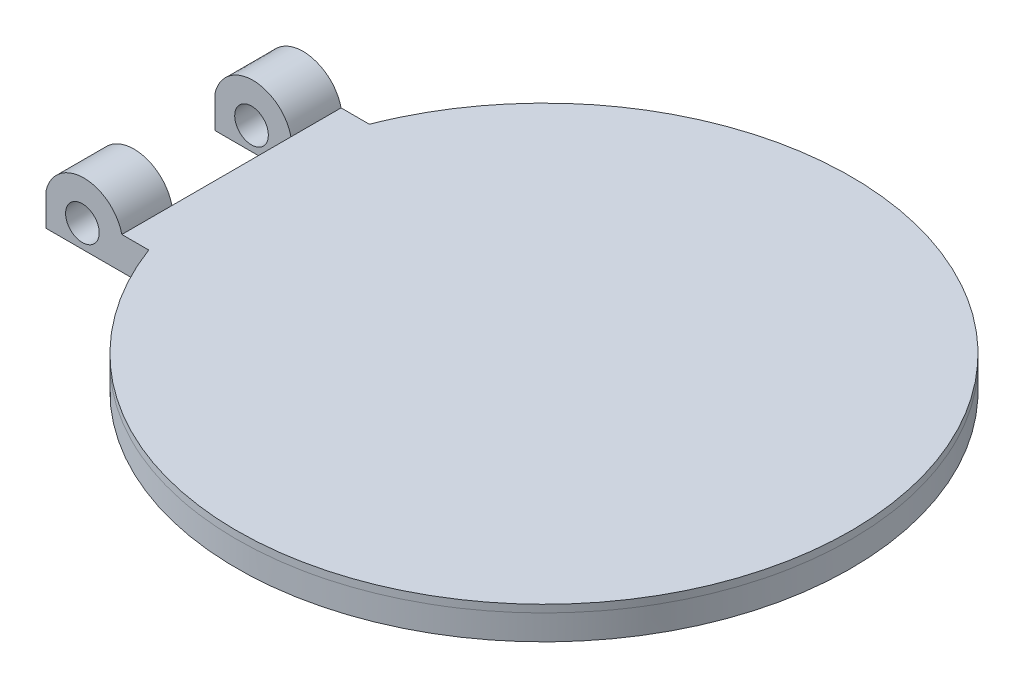
ISO-10303-21;
HEADER;
FILE_DESCRIPTION(('STEP AP214'),'2;1');
FILE_NAME('part.step','',(''),(''),'','','');
FILE_SCHEMA(('AUTOMOTIVE_DESIGN { 1 0 10303 214 1 1 1 1 }'));
ENDSEC;
DATA;
#1=APPLICATION_CONTEXT('core data for automotive mechanical design processes');
#2=APPLICATION_PROTOCOL_DEFINITION('international standard','automotive_design',2000,#1);
#3=PRODUCT_CONTEXT('',#1,'mechanical');
#4=PRODUCT('Part','Part','',(#3));
#5=PRODUCT_RELATED_PRODUCT_CATEGORY('part','',(#4));
#6=PRODUCT_DEFINITION_FORMATION('','',#4);
#7=PRODUCT_DEFINITION_CONTEXT('part definition',#1,'design');
#8=PRODUCT_DEFINITION('design','',#6,#7);
#9=PRODUCT_DEFINITION_SHAPE('','',#8);
#10=(LENGTH_UNIT() NAMED_UNIT(*) SI_UNIT(.MILLI.,.METRE.));
#11=(NAMED_UNIT(*) PLANE_ANGLE_UNIT() SI_UNIT($,.RADIAN.));
#12=(NAMED_UNIT(*) SI_UNIT($,.STERADIAN.) SOLID_ANGLE_UNIT());
#13=UNCERTAINTY_MEASURE_WITH_UNIT(LENGTH_MEASURE(1.E-05),#10,'distance_accuracy_value','');
#14=(GEOMETRIC_REPRESENTATION_CONTEXT(3) GLOBAL_UNCERTAINTY_ASSIGNED_CONTEXT((#13)) GLOBAL_UNIT_ASSIGNED_CONTEXT((#10,
#11,#12)) REPRESENTATION_CONTEXT('',''));
#15=CARTESIAN_POINT('',(0.,0.,0.));
#16=DIRECTION('',(0.,0.,1.));
#17=DIRECTION('',(1.,0.,0.));
#18=AXIS2_PLACEMENT_3D('',#15,#16,#17);
#19=CARTESIAN_POINT('',(-31.8614546867588,2.54,-6.2152367999292));
#20=DIRECTION('',(0.,0.,-1.));
#21=DIRECTION('',(-1.,0.,0.));
#22=AXIS2_PLACEMENT_3D('',#19,#20,#21);
#23=PLANE('',#22);
#24=CARTESIAN_POINT('',(-35.8611696360551,2.29898364712655,-6.2152367999292));
#25=DIRECTION('',(0.,0.,-1.));
#26=DIRECTION('',(-1.,0.,0.));
#27=AXIS2_PLACEMENT_3D('',#24,#25,#26);
#28=CIRCLE('',#27,1.705);
#29=CARTESIAN_POINT('',(-37.5661696360551,2.29898364712655,-6.2152367999292));
#30=VERTEX_POINT('',#29);
#31=EDGE_CURVE('E146',#30,#30,#28,.T.);
#32=ORIENTED_EDGE('',*,*,#31,.T.);
#33=EDGE_LOOP('',(#32));
#34=FACE_BOUND('',#33,.T.);
#35=DIRECTION('',(1.,0.,0.));
#36=VECTOR('',#35,1.);
#37=CARTESIAN_POINT('',(-31.8614546867588,0.,-6.2152367999292));
#38=LINE('',#37,#36);
#39=CARTESIAN_POINT('',(-39.5498190783653,0.,-6.2152367999292));
#40=VERTEX_POINT('',#39);
#41=CARTESIAN_POINT('',(-31.8614546867588,0.,-6.2152367999292));
#42=VERTEX_POINT('',#41);
#43=EDGE_CURVE('E218',#40,#42,#38,.T.);
#44=ORIENTED_EDGE('',*,*,#43,.T.);
#45=DIRECTION('',(0.,-1.,0.));
#46=VECTOR('',#45,1.);
#47=CARTESIAN_POINT('',(-31.8614546867588,2.54,-6.2152367999292));
#48=LINE('',#47,#46);
#49=CARTESIAN_POINT('',(-31.8614546867588,3.302,-6.2152367999292));
#50=VERTEX_POINT('',#49);
#51=EDGE_CURVE('E11',#50,#42,#48,.T.);
#52=ORIENTED_EDGE('',*,*,#51,.F.);
#53=CARTESIAN_POINT('',(-31.8614546867588,3.302,-6.2152367999292));
#54=CARTESIAN_POINT('',(-31.9380304446818,3.62466640864484,-6.2152367999292));
#55=CARTESIAN_POINT('',(-32.1269489707321,4.12864804315735,-6.2152367999292));
#56=CARTESIAN_POINT('',(-32.5409564146606,4.78466357769236,-6.2152367999292));
#57=CARTESIAN_POINT('',(-33.4743287154091,5.83892349980231,-6.2152367999292));
#58=CARTESIAN_POINT('',(-34.7439928306552,6.34180788722324,-6.2152367999292));
#59=CARTESIAN_POINT('',(-36.2043551125884,6.3396155026032,-6.2152367999292));
#60=CARTESIAN_POINT('',(-37.9670368349432,6.00213399305067,-6.2152367999292));
#61=CARTESIAN_POINT('',(-39.2666254501516,4.56558072413033,-6.2152367999292));
#62=CARTESIAN_POINT('',(-39.5498190783653,3.302,-6.2152367999292));
#63=B_SPLINE_CURVE_WITH_KNOTS('',3,(#53,#54,#55,#56,#57,#58,#59,#60,#61,#62),.UNSPECIFIED.,.F.,
.F.,(4,1,1,1,1,1,1,4),(0.,0.0952467607883968,0.153035907428997,0.22174202049672,
0.498962281904311,0.500056145868586,0.641070001091157,1.),.UNSPECIFIED.);
#64=CARTESIAN_POINT('',(-39.5498190783653,3.302,-6.2152367999292));
#65=VERTEX_POINT('',#64);
#66=EDGE_CURVE('E140',#50,#65,#63,.T.);
#67=ORIENTED_EDGE('',*,*,#66,.T.);
#68=DIRECTION('',(0.,-1.,0.));
#69=VECTOR('',#68,1.);
#70=CARTESIAN_POINT('',(-39.5498190783653,2.54,-6.2152367999292));
#71=LINE('',#70,#69);
#72=EDGE_CURVE('E118',#65,#40,#71,.T.);
#73=ORIENTED_EDGE('',*,*,#72,.T.);
#74=EDGE_LOOP('',(#44,#52,#67,#73));
#75=FACE_BOUND('',#74,.T.);
#76=ADVANCED_FACE('F34',(#34,#75),#23,.F.);
#77=CARTESIAN_POINT('',(-31.8614546867588,2.54,-6.2152367999292));
#78=DIRECTION('',(1.,0.,0.));
#79=DIRECTION('',(0.,0.,-1.));
#80=AXIS2_PLACEMENT_3D('',#77,#78,#79);
#81=PLANE('',#80);
#82=DIRECTION('',(0.,0.,1.));
#83=VECTOR('',#82,1.);
#84=CARTESIAN_POINT('',(-31.8614546867588,0.,-6.2152367999292));
#85=LINE('',#84,#83);
#86=CARTESIAN_POINT('',(-31.8614546867588,0.,5.8497632000708));
#87=VERTEX_POINT('',#86);
#88=EDGE_CURVE('E223',#42,#87,#85,.T.);
#89=ORIENTED_EDGE('',*,*,#88,.T.);
#90=DIRECTION('',(0.,-1.,0.));
#91=VECTOR('',#90,1.);
#92=CARTESIAN_POINT('',(-31.8614546867588,2.54,5.8497632000708));
#93=LINE('',#92,#91);
#94=CARTESIAN_POINT('',(-31.8614546867588,3.302,5.8497632000708));
#95=VERTEX_POINT('',#94);
#96=EDGE_CURVE('E42',#95,#87,#93,.T.);
#97=ORIENTED_EDGE('',*,*,#96,.F.);
#98=DIRECTION('',(0.,0.,1.));
#99=VECTOR('',#98,1.);
#100=CARTESIAN_POINT('',(-31.8614546867588,3.302,5.8497632000708));
#101=LINE('',#100,#99);
#102=EDGE_CURVE('E123',#50,#95,#101,.T.);
#103=ORIENTED_EDGE('',*,*,#102,.F.);
#104=ORIENTED_EDGE('',*,*,#51,.T.);
#105=EDGE_LOOP('',(#89,#97,#103,#104));
#106=FACE_BOUND('',#105,.T.);
#107=ADVANCED_FACE('F274',(#106),#81,.F.);
#108=CARTESIAN_POINT('',(-39.5498190783653,2.54,5.8497632000708));
#109=DIRECTION('',(0.,0.,1.));
#110=DIRECTION('',(1.,0.,0.));
#111=AXIS2_PLACEMENT_3D('',#108,#109,#110);
#112=PLANE('',#111);
#113=CARTESIAN_POINT('',(-35.8611696360551,2.29898364712655,5.8497632000708));
#114=DIRECTION('',(0.,0.,1.));
#115=DIRECTION('',(1.,0.,0.));
#116=AXIS2_PLACEMENT_3D('',#113,#114,#115);
#117=CIRCLE('',#116,1.705);
#118=CARTESIAN_POINT('',(-34.1561696360551,2.29898364712655,5.8497632000708));
#119=VERTEX_POINT('',#118);
#120=EDGE_CURVE('E302',#119,#119,#117,.T.);
#121=ORIENTED_EDGE('',*,*,#120,.T.);
#122=EDGE_LOOP('',(#121));
#123=FACE_BOUND('',#122,.T.);
#124=DIRECTION('',(-1.,0.,0.));
#125=VECTOR('',#124,1.);
#126=CARTESIAN_POINT('',(-39.5498190783653,0.,5.8497632000708));
#127=LINE('',#126,#125);
#128=CARTESIAN_POINT('',(-39.5498190783653,0.,5.8497632000708));
#129=VERTEX_POINT('',#128);
#130=EDGE_CURVE('E225',#87,#129,#127,.T.);
#131=ORIENTED_EDGE('',*,*,#130,.T.);
#132=DIRECTION('',(0.,-1.,0.));
#133=VECTOR('',#132,1.);
#134=CARTESIAN_POINT('',(-39.5498190783653,2.54,5.8497632000708));
#135=LINE('',#134,#133);
#136=CARTESIAN_POINT('',(-39.5498190783653,3.302,5.8497632000708));
#137=VERTEX_POINT('',#136);
#138=EDGE_CURVE('E240',#137,#129,#135,.T.);
#139=ORIENTED_EDGE('',*,*,#138,.F.);
#140=CARTESIAN_POINT('',(-35.7056368825621,2.38931660735872,5.8497632000708));
#141=DIRECTION('',(0.,0.,1.));
#142=DIRECTION('',(1.,0.,0.));
#143=AXIS2_PLACEMENT_3D('',#140,#141,#142);
#144=CIRCLE('',#143,3.95104134751004);
#145=EDGE_CURVE('E187',#137,#95,#144,.F.);
#146=ORIENTED_EDGE('',*,*,#145,.T.);
#147=ORIENTED_EDGE('',*,*,#96,.T.);
#148=EDGE_LOOP('',(#131,#139,#146,#147));
#149=FACE_BOUND('',#148,.T.);
#150=ADVANCED_FACE('F271',(#123,#149),#112,.F.);
#151=CARTESIAN_POINT('',(-39.5498190783653,2.54,5.8497632000708));
#152=DIRECTION('',(1.,0.,0.));
#153=DIRECTION('',(0.,0.,-1.));
#154=AXIS2_PLACEMENT_3D('',#151,#152,#153);
#155=PLANE('',#154);
#156=DIRECTION('',(0.,0.,1.));
#157=VECTOR('',#156,1.);
#158=CARTESIAN_POINT('',(-39.5498190783653,0.,5.8497632000708));
#159=LINE('',#158,#157);
#160=CARTESIAN_POINT('',(-39.5498190783653,0.,10.9297632000708));
#161=VERTEX_POINT('',#160);
#162=EDGE_CURVE('E227',#129,#161,#159,.T.);
#163=ORIENTED_EDGE('',*,*,#162,.T.);
#164=DIRECTION('',(0.,-1.,0.));
#165=VECTOR('',#164,1.);
#166=CARTESIAN_POINT('',(-39.5498190783653,2.54,10.9297632000708));
#167=LINE('',#166,#165);
#168=CARTESIAN_POINT('',(-39.5498190783653,3.302,10.9297632000708));
#169=VERTEX_POINT('',#168);
#170=EDGE_CURVE('E237',#169,#161,#167,.T.);
#171=ORIENTED_EDGE('',*,*,#170,.F.);
#172=DIRECTION('',(0.,0.,1.));
#173=VECTOR('',#172,1.);
#174=CARTESIAN_POINT('',(-39.5498190783653,3.302,10.9297632000708));
#175=LINE('',#174,#173);
#176=EDGE_CURVE('E193',#137,#169,#175,.T.);
#177=ORIENTED_EDGE('',*,*,#176,.F.);
#178=ORIENTED_EDGE('',*,*,#138,.T.);
#179=EDGE_LOOP('',(#163,#171,#177,#178));
#180=FACE_BOUND('',#179,.T.);
#181=ADVANCED_FACE('F267',(#180),#155,.F.);
#182=CARTESIAN_POINT('',(-39.5498190783653,2.54,10.9297632000708));
#183=DIRECTION('',(0.,0.,-1.));
#184=DIRECTION('',(-1.,0.,0.));
#185=AXIS2_PLACEMENT_3D('',#182,#183,#184);
#186=PLANE('',#185);
#187=CARTESIAN_POINT('',(-35.8611696360551,2.29898364712655,10.9297632000708));
#188=DIRECTION('',(0.,0.,1.));
#189=DIRECTION('',(1.,0.,0.));
#190=AXIS2_PLACEMENT_3D('',#187,#188,#189);
#191=CIRCLE('',#190,1.705);
#192=CARTESIAN_POINT('',(-34.1561696360551,2.29898364712655,10.9297632000708));
#193=VERTEX_POINT('',#192);
#194=EDGE_CURVE('E307',#193,#193,#191,.T.);
#195=ORIENTED_EDGE('',*,*,#194,.F.);
#196=EDGE_LOOP('',(#195));
#197=FACE_BOUND('',#196,.T.);
#198=DIRECTION('',(1.,0.,0.));
#199=VECTOR('',#198,1.);
#200=CARTESIAN_POINT('',(-39.5498190783653,0.,10.9297632000708));
#201=LINE('',#200,#199);
#202=CARTESIAN_POINT('',(-29.1321729603265,0.,10.9297632000708));
#203=VERTEX_POINT('',#202);
#204=EDGE_CURVE('E229',#161,#203,#201,.T.);
#205=ORIENTED_EDGE('',*,*,#204,.T.);
#206=DIRECTION('',(0.,-1.,0.));
#207=VECTOR('',#206,1.);
#208=CARTESIAN_POINT('',(-29.1321729603265,2.54,10.9297632000708));
#209=LINE('',#208,#207);
#210=CARTESIAN_POINT('',(-29.1321729603265,2.54,10.9297632000708));
#211=VERTEX_POINT('',#210);
#212=EDGE_CURVE('E241',#211,#203,#209,.T.);
#213=ORIENTED_EDGE('',*,*,#212,.F.);
#214=DIRECTION('',(0.,-1.,0.));
#215=VECTOR('',#214,1.);
#216=CARTESIAN_POINT('',(-29.1321729603265,3.302,10.9297632000708));
#217=LINE('',#216,#215);
#218=CARTESIAN_POINT('',(-29.1321729603265,3.302,10.9297632000708));
#219=VERTEX_POINT('',#218);
#220=EDGE_CURVE('E198',#219,#211,#217,.T.);
#221=ORIENTED_EDGE('',*,*,#220,.F.);
#222=DIRECTION('',(1.,0.,0.));
#223=VECTOR('',#222,1.);
#224=CARTESIAN_POINT('',(-29.1321729603265,3.302,10.9297632000708));
#225=LINE('',#224,#223);
#226=CARTESIAN_POINT('',(-31.8614546867588,3.302,10.9297632000708));
#227=VERTEX_POINT('',#226);
#228=EDGE_CURVE('E196',#227,#219,#225,.T.);
#229=ORIENTED_EDGE('',*,*,#228,.F.);
#230=CARTESIAN_POINT('',(-35.7056368825621,2.38931660735872,10.9297632000708));
#231=DIRECTION('',(0.,0.,1.));
#232=DIRECTION('',(-1.,0.,0.));
#233=AXIS2_PLACEMENT_3D('',#230,#231,#232);
#234=CIRCLE('',#233,3.95104134751004);
#235=EDGE_CURVE('E136',#227,#169,#234,.T.);
#236=ORIENTED_EDGE('',*,*,#235,.T.);
#237=ORIENTED_EDGE('',*,*,#170,.T.);
#238=EDGE_LOOP('',(#205,#213,#221,#229,#236,#237));
#239=FACE_BOUND('',#238,.T.);
#240=ADVANCED_FACE('F264',(#197,#239),#186,.F.);
#241=CARTESIAN_POINT('',(0.,2.54,0.));
#242=DIRECTION('',(0.,-1.,0.));
#243=DIRECTION('',(0.,0.,-1.));
#244=AXIS2_PLACEMENT_3D('',#241,#242,#243);
#245=CYLINDRICAL_SURFACE('',#244,31.115);
#246=CARTESIAN_POINT('',(0.,0.,0.));
#247=DIRECTION('',(0.,1.,0.));
#248=DIRECTION('',(0.,0.,1.));
#249=AXIS2_PLACEMENT_3D('',#246,#247,#248);
#250=CIRCLE('',#249,31.115);
#251=CARTESIAN_POINT('',(-28.9924274705228,0.,-11.2952367999292));
#252=VERTEX_POINT('',#251);
#253=EDGE_CURVE('E231',#203,#252,#250,.T.);
#254=ORIENTED_EDGE('',*,*,#253,.T.);
#255=DIRECTION('',(0.,-1.,0.));
#256=VECTOR('',#255,1.);
#257=CARTESIAN_POINT('',(-28.9924274705228,2.54,-11.2952367999292));
#258=LINE('',#257,#256);
#259=CARTESIAN_POINT('',(-28.9924274705228,2.54,-11.2952367999292));
#260=VERTEX_POINT('',#259);
#261=EDGE_CURVE('E132',#260,#252,#258,.T.);
#262=ORIENTED_EDGE('',*,*,#261,.F.);
#263=CARTESIAN_POINT('',(-29.1321729603265,2.54,10.9297632000708));
#264=CARTESIAN_POINT('',(-26.9436923809997,2.54,16.8461678917094));
#265=CARTESIAN_POINT('',(-20.8180935454764,2.54,24.6161234268871));
#266=CARTESIAN_POINT('',(-9.37516536946387,2.54,30.1716202568785));
#267=CARTESIAN_POINT('',(-1.17856983907123,2.54,31.4010883609125));
#268=CARTESIAN_POINT('',(6.43249800673615,2.54,30.6972601479619));
#269=CARTESIAN_POINT('',(14.4768268137274,2.54,28.1242971209111));
#270=CARTESIAN_POINT('',(23.110942207728,2.54,21.9292273824017));
#271=CARTESIAN_POINT('',(29.5535681536737,2.54,11.9136919112089));
#272=CARTESIAN_POINT('',(31.7292279601759,2.54,0.817623449140836));
#273=CARTESIAN_POINT('',(30.1792735452516,2.54,-9.33598735928598));
#274=CARTESIAN_POINT('',(26.2032881389071,2.54,-17.5093738311808));
#275=CARTESIAN_POINT('',(21.1547135741947,2.54,-23.1539969745007));
#276=CARTESIAN_POINT('',(15.0332403142893,2.54,-27.5672567240621));
#277=CARTESIAN_POINT('',(8.14367931852374,2.54,-30.4250380172779));
#278=CARTESIAN_POINT('',(-0.0707342162565505,2.54,-31.4400435766931));
#279=CARTESIAN_POINT('',(-7.73979885920559,2.54,-30.4644004127175));
#280=CARTESIAN_POINT('',(-14.3214477498063,2.54,-27.8851838540043));
#281=CARTESIAN_POINT('',(-22.5224870546639,2.54,-22.4638135617633));
#282=CARTESIAN_POINT('',(-27.0480188494571,2.54,-16.3432281452993));
#283=CARTESIAN_POINT('',(-28.9924274705228,2.54,-11.2952367999292));
#284=B_SPLINE_CURVE_WITH_KNOTS('',3,(#263,#264,#265,#266,#267,#268,#269,#270,#271,#272,#273,
#274,#275,#276,#277,#278,#279,#280,#281,#282,#283),.UNSPECIFIED.,.F.,.F.,(4,1,1,1,1,1,1,1,1,1,1,
1,1,1,1,1,1,1,4),(0.,0.109211854179121,0.164433682460898,0.218205284244614,0.251400155827178,
0.296990172971235,0.363865358868201,0.432195427346562,0.499623073122493,0.556250175597193,
0.608319226247755,0.655848084557177,0.686613069482592,0.739335631636797,0.783787933471067,
0.829490511692908,0.872606176929571,0.905765684602577,1.),.UNSPECIFIED.);
#285=EDGE_CURVE('E203',#211,#260,#284,.T.);
#286=ORIENTED_EDGE('',*,*,#285,.F.);
#287=ORIENTED_EDGE('',*,*,#212,.T.);
#288=EDGE_LOOP('',(#254,#262,#286,#287));
#289=FACE_BOUND('',#288,.T.);
#290=ADVANCED_FACE('F254',(#289),#245,.T.);
#291=CARTESIAN_POINT('',(-39.5498190783653,2.54,-11.2952367999292));
#292=DIRECTION('',(0.,0.,1.));
#293=DIRECTION('',(1.,0.,0.));
#294=AXIS2_PLACEMENT_3D('',#291,#292,#293);
#295=PLANE('',#294);
#296=CARTESIAN_POINT('',(-35.8611696360551,2.29898364712655,-11.2952367999292));
#297=DIRECTION('',(0.,0.,1.));
#298=DIRECTION('',(1.,0.,0.));
#299=AXIS2_PLACEMENT_3D('',#296,#297,#298);
#300=CIRCLE('',#299,1.705);
#301=CARTESIAN_POINT('',(-34.1561696360551,2.29898364712655,-11.2952367999292));
#302=VERTEX_POINT('',#301);
#303=EDGE_CURVE('E37',#302,#302,#300,.T.);
#304=ORIENTED_EDGE('',*,*,#303,.T.);
#305=EDGE_LOOP('',(#304));
#306=FACE_BOUND('',#305,.T.);
#307=DIRECTION('',(-1.,0.,0.));
#308=VECTOR('',#307,1.);
#309=CARTESIAN_POINT('',(-39.5498190783653,0.,-11.2952367999292));
#310=LINE('',#309,#308);
#311=CARTESIAN_POINT('',(-39.5498190783653,0.,-11.2952367999292));
#312=VERTEX_POINT('',#311);
#313=EDGE_CURVE('E131',#252,#312,#310,.T.);
#314=ORIENTED_EDGE('',*,*,#313,.T.);
#315=DIRECTION('',(0.,-1.,0.));
#316=VECTOR('',#315,1.);
#317=CARTESIAN_POINT('',(-39.5498190783653,2.54,-11.2952367999292));
#318=LINE('',#317,#316);
#319=CARTESIAN_POINT('',(-39.5498190783653,3.302,-11.2952367999292));
#320=VERTEX_POINT('',#319);
#321=EDGE_CURVE('E115',#320,#312,#318,.T.);
#322=ORIENTED_EDGE('',*,*,#321,.F.);
#323=CARTESIAN_POINT('',(-31.8614546867588,3.302,-11.2952367999292));
#324=CARTESIAN_POINT('',(-31.9380304446818,3.62466640864484,-11.2952367999292));
#325=CARTESIAN_POINT('',(-32.1269489707321,4.12864804315735,-11.2952367999292));
#326=CARTESIAN_POINT('',(-32.5409564146606,4.78466357769236,-11.2952367999292));
#327=CARTESIAN_POINT('',(-33.4743287154091,5.83892349980231,-11.2952367999292));
#328=CARTESIAN_POINT('',(-34.7439928306552,6.34180788722324,-11.2952367999292));
#329=CARTESIAN_POINT('',(-36.2043551125884,6.3396155026032,-11.2952367999292));
#330=CARTESIAN_POINT('',(-37.9670368349432,6.00213399305067,-11.2952367999292));
#331=CARTESIAN_POINT('',(-39.2666254501516,4.56558072413033,-11.2952367999292));
#332=CARTESIAN_POINT('',(-39.5498190783653,3.302,-11.2952367999292));
#333=B_SPLINE_CURVE_WITH_KNOTS('',3,(#323,#324,#325,#326,#327,#328,#329,#330,#331,#332),
.UNSPECIFIED.,.F.,.F.,(4,1,1,1,1,1,1,4),(0.,0.0952467607883968,0.153035907428997,
0.22174202049672,0.498962281904311,0.500056145868586,0.641070001091157,1.),.UNSPECIFIED.);
#334=CARTESIAN_POINT('',(-31.8614546867588,3.302,-11.2952367999292));
#335=VERTEX_POINT('',#334);
#336=EDGE_CURVE('E127',#320,#335,#333,.F.);
#337=ORIENTED_EDGE('',*,*,#336,.T.);
#338=DIRECTION('',(-1.,0.,0.));
#339=VECTOR('',#338,1.);
#340=CARTESIAN_POINT('',(-39.5498190783653,3.302,-11.2952367999292));
#341=LINE('',#340,#339);
#342=CARTESIAN_POINT('',(-28.9924274705228,3.302,-11.2952367999292));
#343=VERTEX_POINT('',#342);
#344=EDGE_CURVE('E50',#343,#335,#341,.T.);
#345=ORIENTED_EDGE('',*,*,#344,.F.);
#346=DIRECTION('',(0.,-1.,0.));
#347=VECTOR('',#346,1.);
#348=CARTESIAN_POINT('',(-28.9924274705228,3.302,-11.2952367999292));
#349=LINE('',#348,#347);
#350=EDGE_CURVE('E213',#343,#260,#349,.T.);
#351=ORIENTED_EDGE('',*,*,#350,.T.);
#352=ORIENTED_EDGE('',*,*,#261,.T.);
#353=EDGE_LOOP('',(#314,#322,#337,#345,#351,#352));
#354=FACE_BOUND('',#353,.T.);
#355=ADVANCED_FACE('F126',(#306,#354),#295,.F.);
#356=CARTESIAN_POINT('',(-39.5498190783653,2.54,-6.2152367999292));
#357=DIRECTION('',(1.,0.,0.));
#358=DIRECTION('',(0.,0.,-1.));
#359=AXIS2_PLACEMENT_3D('',#356,#357,#358);
#360=PLANE('',#359);
#361=DIRECTION('',(0.,0.,1.));
#362=VECTOR('',#361,1.);
#363=CARTESIAN_POINT('',(-39.5498190783653,0.,-6.2152367999292));
#364=LINE('',#363,#362);
#365=EDGE_CURVE('E234',#312,#40,#364,.T.);
#366=ORIENTED_EDGE('',*,*,#365,.T.);
#367=ORIENTED_EDGE('',*,*,#72,.F.);
#368=DIRECTION('',(0.,0.,1.));
#369=VECTOR('',#368,1.);
#370=CARTESIAN_POINT('',(-39.5498190783653,3.302,-6.2152367999292));
#371=LINE('',#370,#369);
#372=EDGE_CURVE('E112',#320,#65,#371,.T.);
#373=ORIENTED_EDGE('',*,*,#372,.F.);
#374=ORIENTED_EDGE('',*,*,#321,.T.);
#375=EDGE_LOOP('',(#366,#367,#373,#374));
#376=FACE_BOUND('',#375,.T.);
#377=ADVANCED_FACE('F114',(#376),#360,.F.);
#378=CARTESIAN_POINT('',(0.,0.,0.));
#379=DIRECTION('',(0.,1.,0.));
#380=DIRECTION('',(0.,0.,1.));
#381=AXIS2_PLACEMENT_3D('',#378,#379,#380);
#382=PLANE('',#381);
#383=ORIENTED_EDGE('',*,*,#43,.F.);
#384=ORIENTED_EDGE('',*,*,#365,.F.);
#385=ORIENTED_EDGE('',*,*,#313,.F.);
#386=ORIENTED_EDGE('',*,*,#253,.F.);
#387=ORIENTED_EDGE('',*,*,#204,.F.);
#388=ORIENTED_EDGE('',*,*,#162,.F.);
#389=ORIENTED_EDGE('',*,*,#130,.F.);
#390=ORIENTED_EDGE('',*,*,#88,.F.);
#391=EDGE_LOOP('',(#383,#384,#385,#386,#387,#388,#389,#390));
#392=FACE_BOUND('',#391,.T.);
#393=ADVANCED_FACE('F177',(#392),#382,.F.);
#394=CARTESIAN_POINT('',(-29.1321729603265,3.302,10.9297632000708));
#395=CARTESIAN_POINT('',(-26.9436923809997,3.302,16.8461678917094));
#396=CARTESIAN_POINT('',(-20.8180935454764,3.302,24.6161234268871));
#397=CARTESIAN_POINT('',(-9.37516536946387,3.302,30.1716202568785));
#398=CARTESIAN_POINT('',(-1.17856983907123,3.302,31.4010883609125));
#399=CARTESIAN_POINT('',(6.43249800673615,3.302,30.6972601479619));
#400=CARTESIAN_POINT('',(14.4768268137274,3.302,28.1242971209111));
#401=CARTESIAN_POINT('',(23.110942207728,3.302,21.9292273824017));
#402=CARTESIAN_POINT('',(29.5535681536737,3.302,11.9136919112089));
#403=CARTESIAN_POINT('',(31.7292279601759,3.302,0.817623449140836));
#404=CARTESIAN_POINT('',(30.1792735452516,3.302,-9.33598735928598));
#405=CARTESIAN_POINT('',(26.2032881389071,3.302,-17.5093738311808));
#406=CARTESIAN_POINT('',(21.1547135741947,3.302,-23.1539969745007));
#407=CARTESIAN_POINT('',(15.0332403142893,3.302,-27.5672567240621));
#408=CARTESIAN_POINT('',(8.14367931852374,3.302,-30.4250380172779));
#409=CARTESIAN_POINT('',(-0.0707342162565505,3.302,-31.4400435766931));
#410=CARTESIAN_POINT('',(-7.73979885920559,3.302,-30.4644004127175));
#411=CARTESIAN_POINT('',(-14.3214477498063,3.302,-27.8851838540043));
#412=CARTESIAN_POINT('',(-22.5224870546639,3.302,-22.4638135617633));
#413=CARTESIAN_POINT('',(-27.0480188494571,3.302,-16.3432281452993));
#414=CARTESIAN_POINT('',(-28.9924274705228,3.302,-11.2952367999292));
#415=B_SPLINE_CURVE_WITH_KNOTS('',3,(#394,#395,#396,#397,#398,#399,#400,#401,#402,#403,#404,
#405,#406,#407,#408,#409,#410,#411,#412,#413,#414),.UNSPECIFIED.,.F.,.F.,(4,1,1,1,1,1,1,1,1,1,1,
1,1,1,1,1,1,1,4),(0.,0.109211854179121,0.164433682460898,0.218205284244614,0.251400155827178,
0.296990172971235,0.363865358868201,0.432195427346562,0.499623073122493,0.556250175597193,
0.608319226247755,0.655848084557177,0.686613069482592,0.739335631636797,0.783787933471067,
0.829490511692908,0.872606176929571,0.905765684602577,1.),.UNSPECIFIED.);
#416=DIRECTION('',(0.,-1.,0.));
#417=VECTOR('',#416,1.);
#418=SURFACE_OF_LINEAR_EXTRUSION('',#415,#417);
#419=ORIENTED_EDGE('',*,*,#285,.T.);
#420=ORIENTED_EDGE('',*,*,#350,.F.);
#421=EDGE_CURVE('E181',#219,#343,#415,.T.);
#422=ORIENTED_EDGE('',*,*,#421,.F.);
#423=ORIENTED_EDGE('',*,*,#220,.T.);
#424=EDGE_LOOP('',(#419,#420,#422,#423));
#425=FACE_BOUND('',#424,.T.);
#426=ADVANCED_FACE('F172',(#425),#418,.F.);
#427=CARTESIAN_POINT('',(31.1147442856571,3.302,0.130436553189945));
#428=DIRECTION('',(0.,1.,0.));
#429=DIRECTION('',(0.,0.,1.));
#430=AXIS2_PLACEMENT_3D('',#427,#428,#429);
#431=PLANE('',#430);
#432=DIRECTION('',(0.,0.,1.));
#433=VECTOR('',#432,1.);
#434=CARTESIAN_POINT('',(-31.8614546867588,3.302,-19.562726080802));
#435=LINE('',#434,#433);
#436=EDGE_CURVE('E135',#335,#50,#435,.T.);
#437=ORIENTED_EDGE('',*,*,#436,.T.);
#438=ORIENTED_EDGE('',*,*,#102,.T.);
#439=DIRECTION('',(0.,0.,1.));
#440=VECTOR('',#439,1.);
#441=CARTESIAN_POINT('',(-31.8614546867588,3.302,-2.41719307657885));
#442=LINE('',#441,#440);
#443=EDGE_CURVE('E57',#95,#227,#442,.T.);
#444=ORIENTED_EDGE('',*,*,#443,.T.);
#445=ORIENTED_EDGE('',*,*,#228,.T.);
#446=ORIENTED_EDGE('',*,*,#421,.T.);
#447=ORIENTED_EDGE('',*,*,#344,.T.);
#448=EDGE_LOOP('',(#437,#438,#444,#445,#446,#447));
#449=FACE_BOUND('',#448,.T.);
#450=ADVANCED_FACE('F168',(#449),#431,.T.);
#451=CARTESIAN_POINT('',(-35.7056368825621,2.38931660735872,-2.41719307657885));
#452=DIRECTION('',(0.,0.,1.));
#453=DIRECTION('',(1.,0.,0.));
#454=AXIS2_PLACEMENT_3D('',#451,#452,#453);
#455=CYLINDRICAL_SURFACE('',#454,3.95104134751004);
#456=ORIENTED_EDGE('',*,*,#145,.F.);
#457=ORIENTED_EDGE('',*,*,#176,.T.);
#458=ORIENTED_EDGE('',*,*,#235,.F.);
#459=ORIENTED_EDGE('',*,*,#443,.F.);
#460=EDGE_LOOP('',(#456,#457,#458,#459));
#461=FACE_BOUND('',#460,.T.);
#462=ADVANCED_FACE('F165',(#461),#455,.T.);
#463=CARTESIAN_POINT('',(-31.8614546867588,3.302,-19.562726080802));
#464=CARTESIAN_POINT('',(-31.9380304446818,3.62466640864484,-19.562726080802));
#465=CARTESIAN_POINT('',(-32.1269489707321,4.12864804315735,-19.562726080802));
#466=CARTESIAN_POINT('',(-32.5409564146606,4.78466357769236,-19.562726080802));
#467=CARTESIAN_POINT('',(-33.4743287154091,5.83892349980231,-19.562726080802));
#468=CARTESIAN_POINT('',(-34.7439928306552,6.34180788722324,-19.562726080802));
#469=CARTESIAN_POINT('',(-36.2043551125884,6.3396155026032,-19.562726080802));
#470=CARTESIAN_POINT('',(-37.9670368349432,6.00213399305067,-19.562726080802));
#471=CARTESIAN_POINT('',(-39.2666254501516,4.56558072413033,-19.562726080802));
#472=CARTESIAN_POINT('',(-39.5498190783653,3.302,-19.562726080802));
#473=B_SPLINE_CURVE_WITH_KNOTS('',3,(#463,#464,#465,#466,#467,#468,#469,#470,#471,#472),
.UNSPECIFIED.,.F.,.F.,(4,1,1,1,1,1,1,4),(0.,0.0952467607883968,0.153035907428997,
0.22174202049672,0.498962281904311,0.500056145868586,0.641070001091157,1.),.UNSPECIFIED.);
#474=DIRECTION('',(0.,0.,1.));
#475=VECTOR('',#474,1.);
#476=SURFACE_OF_LINEAR_EXTRUSION('',#473,#475);
#477=ORIENTED_EDGE('',*,*,#336,.F.);
#478=ORIENTED_EDGE('',*,*,#372,.T.);
#479=ORIENTED_EDGE('',*,*,#66,.F.);
#480=ORIENTED_EDGE('',*,*,#436,.F.);
#481=EDGE_LOOP('',(#477,#478,#479,#480));
#482=FACE_BOUND('',#481,.T.);
#483=ADVANCED_FACE('F134',(#482),#476,.T.);
#484=CARTESIAN_POINT('',(-35.8611696360551,2.29898364712655,-20.3122367999292));
#485=DIRECTION('',(0.,0.,1.));
#486=DIRECTION('',(1.,0.,0.));
#487=AXIS2_PLACEMENT_3D('',#484,#485,#486);
#488=CYLINDRICAL_SURFACE('',#487,1.705);
#489=ORIENTED_EDGE('',*,*,#303,.F.);
#490=EDGE_LOOP('',(#489));
#491=FACE_BOUND('',#490,.T.);
#492=ORIENTED_EDGE('',*,*,#31,.F.);
#493=EDGE_LOOP('',(#492));
#494=FACE_BOUND('',#493,.T.);
#495=ADVANCED_FACE('F164',(#491,#494),#488,.F.);
#496=ORIENTED_EDGE('',*,*,#194,.T.);
#497=EDGE_LOOP('',(#496));
#498=FACE_BOUND('',#497,.T.);
#499=ORIENTED_EDGE('',*,*,#120,.F.);
#500=EDGE_LOOP('',(#499));
#501=FACE_BOUND('',#500,.T.);
#502=ADVANCED_FACE('F312',(#498,#501),#488,.F.);
#503=CLOSED_SHELL('',(#76,#107,#150,#181,#240,#290,#355,#377,#393,#426,#450,#462,#483,#495,#502));
#504=MANIFOLD_SOLID_BREP('B2',#503);
#505=ADVANCED_BREP_SHAPE_REPRESENTATION('',(#18,#504),#14);
#506=SHAPE_DEFINITION_REPRESENTATION(#9,#505);
ENDSEC;
END-ISO-10303-21;
